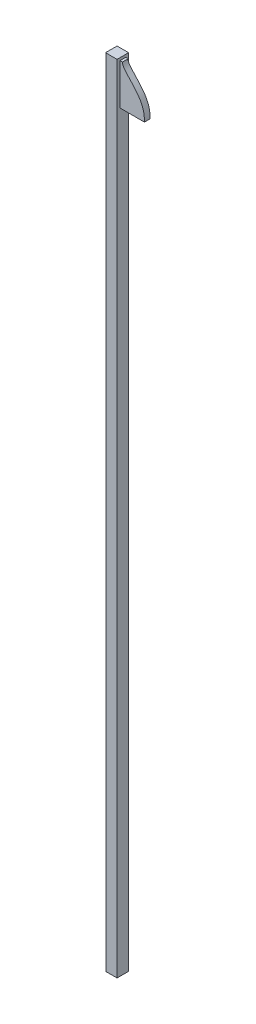
ISO-10303-21;
HEADER;
FILE_DESCRIPTION(('STEP AP214'),'2;1');
FILE_NAME('part.step','',(''),(''),'','','');
FILE_SCHEMA(('AUTOMOTIVE_DESIGN { 1 0 10303 214 1 1 1 1 }'));
ENDSEC;
DATA;
#1=APPLICATION_CONTEXT('core data for automotive mechanical design processes');
#2=APPLICATION_PROTOCOL_DEFINITION('international standard','automotive_design',2000,#1);
#3=PRODUCT_CONTEXT('',#1,'mechanical');
#4=PRODUCT('Part','Part','',(#3));
#5=PRODUCT_RELATED_PRODUCT_CATEGORY('part','',(#4));
#6=PRODUCT_DEFINITION_FORMATION('','',#4);
#7=PRODUCT_DEFINITION_CONTEXT('part definition',#1,'design');
#8=PRODUCT_DEFINITION('design','',#6,#7);
#9=PRODUCT_DEFINITION_SHAPE('','',#8);
#10=(LENGTH_UNIT() NAMED_UNIT(*) SI_UNIT(.MILLI.,.METRE.));
#11=(NAMED_UNIT(*) PLANE_ANGLE_UNIT() SI_UNIT($,.RADIAN.));
#12=(NAMED_UNIT(*) SI_UNIT($,.STERADIAN.) SOLID_ANGLE_UNIT());
#13=UNCERTAINTY_MEASURE_WITH_UNIT(LENGTH_MEASURE(1.E-05),#10,'distance_accuracy_value','');
#14=(GEOMETRIC_REPRESENTATION_CONTEXT(3) GLOBAL_UNCERTAINTY_ASSIGNED_CONTEXT((#13)) GLOBAL_UNIT_ASSIGNED_CONTEXT((#10,
#11,#12)) REPRESENTATION_CONTEXT('',''));
#15=CARTESIAN_POINT('',(0.,0.,0.));
#16=DIRECTION('',(0.,0.,1.));
#17=DIRECTION('',(1.,0.,0.));
#18=AXIS2_PLACEMENT_3D('',#15,#16,#17);
#19=CARTESIAN_POINT('',(-0.754271379437274,2.9,0.110173502610086));
#20=CARTESIAN_POINT('',(-0.756059911881393,2.89082989636708,0.110173502610086));
#21=CARTESIAN_POINT('',(-0.757688052822413,2.87160599650294,0.110173502610086));
#22=CARTESIAN_POINT('',(-0.754283259268477,2.84011903002906,0.110173502610086));
#23=CARTESIAN_POINT('',(-0.737966519602591,2.79279596856583,0.110173502610086));
#24=CARTESIAN_POINT('',(-0.697785468714333,2.7245390714351,0.110173502610086));
#25=CARTESIAN_POINT('',(-0.638294458126951,2.64698716653611,0.110173502610086));
#26=CARTESIAN_POINT('',(-0.561118331093695,2.56007299012793,0.110173502610086));
#27=CARTESIAN_POINT('',(-0.469917194208403,2.46405442724653,0.110173502610086));
#28=CARTESIAN_POINT('',(-0.370218593172325,2.35951057822847,0.110173502610086));
#29=CARTESIAN_POINT('',(-0.268406549547145,2.24717531020337,0.110173502610086));
#30=CARTESIAN_POINT('',(-0.170985439766142,2.1278493463251,0.110173502610086));
#31=CARTESIAN_POINT('',(-0.083811744606569,2.00231200075987,0.110173502610086));
#32=CARTESIAN_POINT('',(-0.0111822678173812,1.87125590361862,0.110173502610086));
#33=CARTESIAN_POINT('',(0.0446474719014038,1.7352418345057,0.110173502610086));
#34=CARTESIAN_POINT('',(0.0827004100197384,1.59469395369209,0.110173502610086));
#35=CARTESIAN_POINT('',(0.0988101809346095,1.47885746966527,0.110173502610086));
#36=CARTESIAN_POINT('',(0.102928931664183,1.39013939139415,0.110173502610086));
#37=CARTESIAN_POINT('',(0.102161316913395,1.33018182743931,0.110173502610086));
#38=CARTESIAN_POINT('',(0.100899125819202,1.3,0.110173502610086));
#39=B_SPLINE_CURVE_WITH_KNOTS('',5,(#19,#20,#21,#22,#23,#24,#25,#26,#27,#28,#29,#30,#31,#32,#33,
#34,#35,#36,#37,#38),.UNSPECIFIED.,.F.,.F.,(6,1,1,1,1,1,1,1,1,1,1,1,1,1,1,6),(0.,
0.0666666666666667,0.133333333333333,0.2,0.266666666666667,0.333333333333333,0.4,
0.466666666666667,0.533333333333333,0.6,0.666666666666667,0.733333333333333,0.8,
0.866666666666667,0.933333333333333,1.),.UNSPECIFIED.);
#40=DIRECTION('',(0.,0.,-1.));
#41=VECTOR('',#40,1.);
#42=SURFACE_OF_LINEAR_EXTRUSION('',#39,#41);
#43=CARTESIAN_POINT('',(-0.754271379437274,2.9,-0.110173502610086));
#44=CARTESIAN_POINT('',(-0.756059911881393,2.89082989636708,-0.110173502610086));
#45=CARTESIAN_POINT('',(-0.757688052822413,2.87160599650294,-0.110173502610086));
#46=CARTESIAN_POINT('',(-0.754283259268477,2.84011903002906,-0.110173502610086));
#47=CARTESIAN_POINT('',(-0.737966519602591,2.79279596856583,-0.110173502610086));
#48=CARTESIAN_POINT('',(-0.697785468714333,2.7245390714351,-0.110173502610086));
#49=CARTESIAN_POINT('',(-0.638294458126951,2.64698716653611,-0.110173502610086));
#50=CARTESIAN_POINT('',(-0.561118331093695,2.56007299012793,-0.110173502610086));
#51=CARTESIAN_POINT('',(-0.469917194208403,2.46405442724653,-0.110173502610086));
#52=CARTESIAN_POINT('',(-0.370218593172325,2.35951057822847,-0.110173502610086));
#53=CARTESIAN_POINT('',(-0.268406549547145,2.24717531020337,-0.110173502610086));
#54=CARTESIAN_POINT('',(-0.170985439766142,2.1278493463251,-0.110173502610086));
#55=CARTESIAN_POINT('',(-0.083811744606569,2.00231200075987,-0.110173502610086));
#56=CARTESIAN_POINT('',(-0.0111822678173812,1.87125590361862,-0.110173502610086));
#57=CARTESIAN_POINT('',(0.0446474719014038,1.7352418345057,-0.110173502610086));
#58=CARTESIAN_POINT('',(0.0827004100197384,1.59469395369209,-0.110173502610086));
#59=CARTESIAN_POINT('',(0.0988101809346095,1.47885746966527,-0.110173502610086));
#60=CARTESIAN_POINT('',(0.102928931664183,1.39013939139415,-0.110173502610086));
#61=CARTESIAN_POINT('',(0.102161316913395,1.33018182743931,-0.110173502610086));
#62=CARTESIAN_POINT('',(0.100899125819202,1.3,-0.110173502610086));
#63=B_SPLINE_CURVE_WITH_KNOTS('',5,(#43,#44,#45,#46,#47,#48,#49,#50,#51,#52,#53,#54,#55,#56,#57,
#58,#59,#60,#61,#62),.UNSPECIFIED.,.F.,.F.,(6,1,1,1,1,1,1,1,1,1,1,1,1,1,1,6),(0.,
0.0666666666666667,0.133333333333333,0.2,0.266666666666667,0.333333333333333,0.4,
0.466666666666667,0.533333333333333,0.6,0.666666666666667,0.733333333333333,0.8,
0.866666666666667,0.933333333333333,1.),.UNSPECIFIED.);
#64=CARTESIAN_POINT('',(-0.754271379437274,2.9,-0.110173502610086));
#65=VERTEX_POINT('',#64);
#66=CARTESIAN_POINT('',(0.100899125819202,1.3,-0.110173502610086));
#67=VERTEX_POINT('',#66);
#68=EDGE_CURVE('E141',#65,#67,#63,.T.);
#69=ORIENTED_EDGE('',*,*,#68,.F.);
#70=DIRECTION('',(0.,0.,-1.));
#71=VECTOR('',#70,1.);
#72=CARTESIAN_POINT('',(-0.754271379437274,2.9,0.110173502610086));
#73=LINE('',#72,#71);
#74=CARTESIAN_POINT('',(-0.754271379437274,2.9,0.110173502610086));
#75=VERTEX_POINT('',#74);
#76=EDGE_CURVE('E130',#75,#65,#73,.T.);
#77=ORIENTED_EDGE('',*,*,#76,.F.);
#78=CARTESIAN_POINT('',(0.100899125819202,1.3,0.110173502610086));
#79=VERTEX_POINT('',#78);
#80=EDGE_CURVE('E143',#75,#79,#39,.T.);
#81=ORIENTED_EDGE('',*,*,#80,.T.);
#82=DIRECTION('',(0.,0.,-1.));
#83=VECTOR('',#82,1.);
#84=CARTESIAN_POINT('',(0.100899125819202,1.3,0.110173502610086));
#85=LINE('',#84,#83);
#86=EDGE_CURVE('E212',#79,#67,#85,.T.);
#87=ORIENTED_EDGE('',*,*,#86,.T.);
#88=EDGE_LOOP('',(#69,#77,#81,#87));
#89=FACE_BOUND('',#88,.T.);
#90=ADVANCED_FACE('F33',(#89),#42,.T.);
#91=CARTESIAN_POINT('',(-0.85,2.9,0.110173502610086));
#92=DIRECTION('',(0.,1.,0.));
#93=DIRECTION('',(0.,0.,1.));
#94=AXIS2_PLACEMENT_3D('',#91,#92,#93);
#95=PLANE('',#94);
#96=DIRECTION('',(1.,0.,0.));
#97=VECTOR('',#96,1.);
#98=CARTESIAN_POINT('',(-0.85,2.9,-0.110173502610086));
#99=LINE('',#98,#97);
#100=CARTESIAN_POINT('',(-0.85,2.9,-0.110173502610086));
#101=VERTEX_POINT('',#100);
#102=EDGE_CURVE('E150',#101,#65,#99,.T.);
#103=ORIENTED_EDGE('',*,*,#102,.F.);
#104=DIRECTION('',(0.,0.,-1.));
#105=VECTOR('',#104,1.);
#106=CARTESIAN_POINT('',(-0.85,2.9,0.110173502610086));
#107=LINE('',#106,#105);
#108=CARTESIAN_POINT('',(-0.85,2.9,0.110173502610086));
#109=VERTEX_POINT('',#108);
#110=EDGE_CURVE('E211',#109,#101,#107,.T.);
#111=ORIENTED_EDGE('',*,*,#110,.F.);
#112=DIRECTION('',(1.,0.,0.));
#113=VECTOR('',#112,1.);
#114=CARTESIAN_POINT('',(-0.85,2.9,0.110173502610086));
#115=LINE('',#114,#113);
#116=EDGE_CURVE('E215',#109,#75,#115,.T.);
#117=ORIENTED_EDGE('',*,*,#116,.T.);
#118=ORIENTED_EDGE('',*,*,#76,.T.);
#119=EDGE_LOOP('',(#103,#111,#117,#118));
#120=FACE_BOUND('',#119,.T.);
#121=ADVANCED_FACE('F157',(#120),#95,.T.);
#122=CARTESIAN_POINT('',(0.100899125819202,1.3,0.110173502610086));
#123=DIRECTION('',(0.,-1.,0.));
#124=DIRECTION('',(0.,0.,-1.));
#125=AXIS2_PLACEMENT_3D('',#122,#123,#124);
#126=PLANE('',#125);
#127=DIRECTION('',(-1.,0.,0.));
#128=VECTOR('',#127,1.);
#129=CARTESIAN_POINT('',(0.100899125819202,1.3,-0.110173502610086));
#130=LINE('',#129,#128);
#131=CARTESIAN_POINT('',(-0.85,1.3,-0.110173502610086));
#132=VERTEX_POINT('',#131);
#133=EDGE_CURVE('E223',#67,#132,#130,.T.);
#134=ORIENTED_EDGE('',*,*,#133,.F.);
#135=ORIENTED_EDGE('',*,*,#86,.F.);
#136=DIRECTION('',(-1.,0.,0.));
#137=VECTOR('',#136,1.);
#138=CARTESIAN_POINT('',(0.100899125819202,1.3,0.110173502610086));
#139=LINE('',#138,#137);
#140=CARTESIAN_POINT('',(-0.85,1.3,0.110173502610086));
#141=VERTEX_POINT('',#140);
#142=EDGE_CURVE('E149',#79,#141,#139,.T.);
#143=ORIENTED_EDGE('',*,*,#142,.T.);
#144=DIRECTION('',(0.,0.,-1.));
#145=VECTOR('',#144,1.);
#146=CARTESIAN_POINT('',(-0.85,1.3,0.110173502610086));
#147=LINE('',#146,#145);
#148=EDGE_CURVE('E205',#141,#132,#147,.T.);
#149=ORIENTED_EDGE('',*,*,#148,.T.);
#150=EDGE_LOOP('',(#134,#135,#143,#149));
#151=FACE_BOUND('',#150,.T.);
#152=ADVANCED_FACE('F159',(#151),#126,.T.);
#153=CARTESIAN_POINT('',(-0.319454777182765,2.30241907387232,0.110173502610086));
#154=DIRECTION('',(0.,0.,-1.));
#155=DIRECTION('',(-1.,0.,0.));
#156=AXIS2_PLACEMENT_3D('',#153,#154,#155);
#157=PLANE('',#156);
#158=ORIENTED_EDGE('',*,*,#80,.F.);
#159=ORIENTED_EDGE('',*,*,#116,.F.);
#160=DIRECTION('',(0.,1.,0.));
#161=VECTOR('',#160,1.);
#162=CARTESIAN_POINT('',(-0.85,1.3,0.110173502610086));
#163=LINE('',#162,#161);
#164=EDGE_CURVE('E207',#141,#109,#163,.T.);
#165=ORIENTED_EDGE('',*,*,#164,.F.);
#166=ORIENTED_EDGE('',*,*,#142,.F.);
#167=EDGE_LOOP('',(#158,#159,#165,#166));
#168=FACE_BOUND('',#167,.T.);
#169=ADVANCED_FACE('F162',(#168),#157,.F.);
#170=CARTESIAN_POINT('',(-0.319454777182765,2.30241907387232,-0.110173502610086));
#171=DIRECTION('',(0.,0.,-1.));
#172=DIRECTION('',(-1.,0.,0.));
#173=AXIS2_PLACEMENT_3D('',#170,#171,#172);
#174=PLANE('',#173);
#175=DIRECTION('',(0.,-1.,0.));
#176=VECTOR('',#175,1.);
#177=CARTESIAN_POINT('',(-0.85,-28.,-0.110173502610086));
#178=LINE('',#177,#176);
#179=EDGE_CURVE('E128',#101,#132,#178,.T.);
#180=ORIENTED_EDGE('',*,*,#179,.F.);
#181=ORIENTED_EDGE('',*,*,#102,.T.);
#182=ORIENTED_EDGE('',*,*,#68,.T.);
#183=ORIENTED_EDGE('',*,*,#133,.T.);
#184=EDGE_LOOP('',(#180,#181,#182,#183));
#185=FACE_BOUND('',#184,.T.);
#186=ADVANCED_FACE('F167',(#185),#174,.T.);
#187=CARTESIAN_POINT('',(-0.85,0.,0.));
#188=DIRECTION('',(1.,0.,0.));
#189=DIRECTION('',(0.,0.,-1.));
#190=AXIS2_PLACEMENT_3D('',#187,#188,#189);
#191=PLANE('',#190);
#192=DIRECTION('',(0.,-1.,0.));
#193=VECTOR('',#192,1.);
#194=CARTESIAN_POINT('',(-0.85,-28.,-0.225));
#195=LINE('',#194,#193);
#196=CARTESIAN_POINT('',(-0.85,3.,-0.225));
#197=VERTEX_POINT('',#196);
#198=CARTESIAN_POINT('',(-0.85,-28.,-0.225));
#199=VERTEX_POINT('',#198);
#200=EDGE_CURVE('E118',#197,#199,#195,.T.);
#201=ORIENTED_EDGE('',*,*,#200,.F.);
#202=DIRECTION('',(0.,0.,1.));
#203=VECTOR('',#202,1.);
#204=CARTESIAN_POINT('',(-0.85,3.,-0.110173502610086));
#205=LINE('',#204,#203);
#206=CARTESIAN_POINT('',(-0.85,3.,0.225));
#207=VERTEX_POINT('',#206);
#208=EDGE_CURVE('E114',#197,#207,#205,.T.);
#209=ORIENTED_EDGE('',*,*,#208,.T.);
#210=DIRECTION('',(0.,-1.,0.));
#211=VECTOR('',#210,1.);
#212=CARTESIAN_POINT('',(-0.85,3.,0.225));
#213=LINE('',#212,#211);
#214=CARTESIAN_POINT('',(-0.85,-28.,0.225));
#215=VERTEX_POINT('',#214);
#216=EDGE_CURVE('E135',#207,#215,#213,.T.);
#217=ORIENTED_EDGE('',*,*,#216,.T.);
#218=DIRECTION('',(0.,0.,-1.));
#219=VECTOR('',#218,1.);
#220=CARTESIAN_POINT('',(-0.85,-28.,0.225));
#221=LINE('',#220,#219);
#222=EDGE_CURVE('E108',#215,#199,#221,.T.);
#223=ORIENTED_EDGE('',*,*,#222,.T.);
#224=EDGE_LOOP('',(#201,#209,#217,#223));
#225=FACE_BOUND('',#224,.T.);
#226=ORIENTED_EDGE('',*,*,#148,.F.);
#227=ORIENTED_EDGE('',*,*,#164,.T.);
#228=ORIENTED_EDGE('',*,*,#110,.T.);
#229=ORIENTED_EDGE('',*,*,#179,.T.);
#230=EDGE_LOOP('',(#226,#227,#228,#229));
#231=FACE_BOUND('',#230,.T.);
#232=ADVANCED_FACE('F170',(#225,#231),#191,.T.);
#233=CARTESIAN_POINT('',(-1.3,-28.,0.225));
#234=DIRECTION('',(0.,-1.,0.));
#235=DIRECTION('',(0.,0.,-1.));
#236=AXIS2_PLACEMENT_3D('',#233,#234,#235);
#237=PLANE('',#236);
#238=DIRECTION('',(1.,0.,0.));
#239=VECTOR('',#238,1.);
#240=CARTESIAN_POINT('',(-1.3,-28.,0.225));
#241=LINE('',#240,#239);
#242=CARTESIAN_POINT('',(-1.275,-28.,0.225));
#243=VERTEX_POINT('',#242);
#244=EDGE_CURVE('E139',#243,#215,#241,.T.);
#245=ORIENTED_EDGE('',*,*,#244,.F.);
#246=CARTESIAN_POINT('',(-1.275,-28.,0.2));
#247=DIRECTION('',(0.,-1.,0.));
#248=DIRECTION('',(0.,0.,-1.));
#249=AXIS2_PLACEMENT_3D('',#246,#247,#248);
#250=CIRCLE('',#249,0.025);
#251=CARTESIAN_POINT('',(-1.3,-28.,0.2));
#252=VERTEX_POINT('',#251);
#253=EDGE_CURVE('E55',#243,#252,#250,.T.);
#254=ORIENTED_EDGE('',*,*,#253,.T.);
#255=DIRECTION('',(0.,0.,-1.));
#256=VECTOR('',#255,1.);
#257=CARTESIAN_POINT('',(-1.3,-28.,0.225));
#258=LINE('',#257,#256);
#259=CARTESIAN_POINT('',(-1.3,-28.,-0.225));
#260=VERTEX_POINT('',#259);
#261=EDGE_CURVE('E107',#252,#260,#258,.T.);
#262=ORIENTED_EDGE('',*,*,#261,.T.);
#263=DIRECTION('',(-1.,0.,0.));
#264=VECTOR('',#263,1.);
#265=CARTESIAN_POINT('',(-1.3,-28.,-0.225));
#266=LINE('',#265,#264);
#267=EDGE_CURVE('E123',#199,#260,#266,.T.);
#268=ORIENTED_EDGE('',*,*,#267,.F.);
#269=ORIENTED_EDGE('',*,*,#222,.F.);
#270=EDGE_LOOP('',(#245,#254,#262,#268,#269));
#271=FACE_BOUND('',#270,.T.);
#272=ADVANCED_FACE('F180',(#271),#237,.T.);
#273=CARTESIAN_POINT('',(-1.3,3.,0.225));
#274=DIRECTION('',(0.,0.,1.));
#275=DIRECTION('',(1.,0.,0.));
#276=AXIS2_PLACEMENT_3D('',#273,#274,#275);
#277=PLANE('',#276);
#278=DIRECTION('',(1.,0.,0.));
#279=VECTOR('',#278,1.);
#280=CARTESIAN_POINT('',(-1.3,3.,0.225));
#281=LINE('',#280,#279);
#282=CARTESIAN_POINT('',(-1.275,3.,0.225));
#283=VERTEX_POINT('',#282);
#284=EDGE_CURVE('E133',#283,#207,#281,.T.);
#285=ORIENTED_EDGE('',*,*,#284,.F.);
#286=DIRECTION('',(0.,-1.,0.));
#287=VECTOR('',#286,1.);
#288=CARTESIAN_POINT('',(-1.275,-28.,0.225));
#289=LINE('',#288,#287);
#290=EDGE_CURVE('E129',#283,#243,#289,.T.);
#291=ORIENTED_EDGE('',*,*,#290,.T.);
#292=ORIENTED_EDGE('',*,*,#244,.T.);
#293=ORIENTED_EDGE('',*,*,#216,.F.);
#294=EDGE_LOOP('',(#285,#291,#292,#293));
#295=FACE_BOUND('',#294,.T.);
#296=ADVANCED_FACE('F177',(#295),#277,.T.);
#297=CARTESIAN_POINT('',(-1.3,3.,-0.110173502610086));
#298=DIRECTION('',(0.,1.,0.));
#299=DIRECTION('',(0.,0.,1.));
#300=AXIS2_PLACEMENT_3D('',#297,#298,#299);
#301=PLANE('',#300);
#302=DIRECTION('',(0.,0.,1.));
#303=VECTOR('',#302,1.);
#304=CARTESIAN_POINT('',(-1.3,3.,-0.110173502610086));
#305=LINE('',#304,#303);
#306=CARTESIAN_POINT('',(-1.3,3.,-0.225));
#307=VERTEX_POINT('',#306);
#308=CARTESIAN_POINT('',(-1.3,3.,0.2));
#309=VERTEX_POINT('',#308);
#310=EDGE_CURVE('E100',#307,#309,#305,.T.);
#311=ORIENTED_EDGE('',*,*,#310,.T.);
#312=CARTESIAN_POINT('',(-1.275,3.,0.2));
#313=DIRECTION('',(0.,1.,0.));
#314=DIRECTION('',(0.,0.,1.));
#315=AXIS2_PLACEMENT_3D('',#312,#313,#314);
#316=CIRCLE('',#315,0.025);
#317=EDGE_CURVE('E11',#309,#283,#316,.T.);
#318=ORIENTED_EDGE('',*,*,#317,.T.);
#319=ORIENTED_EDGE('',*,*,#284,.T.);
#320=ORIENTED_EDGE('',*,*,#208,.F.);
#321=DIRECTION('',(1.,0.,0.));
#322=VECTOR('',#321,1.);
#323=CARTESIAN_POINT('',(-0.85,3.,-0.225));
#324=LINE('',#323,#322);
#325=EDGE_CURVE('E111',#307,#197,#324,.T.);
#326=ORIENTED_EDGE('',*,*,#325,.F.);
#327=EDGE_LOOP('',(#311,#318,#319,#320,#326));
#328=FACE_BOUND('',#327,.T.);
#329=ADVANCED_FACE('F112',(#328),#301,.T.);
#330=CARTESIAN_POINT('',(-1.3,0.,0.));
#331=DIRECTION('',(1.,0.,0.));
#332=DIRECTION('',(0.,0.,-1.));
#333=AXIS2_PLACEMENT_3D('',#330,#331,#332);
#334=PLANE('',#333);
#335=ORIENTED_EDGE('',*,*,#261,.F.);
#336=DIRECTION('',(0.,-1.,0.));
#337=VECTOR('',#336,1.);
#338=CARTESIAN_POINT('',(-1.3,3.,0.2));
#339=LINE('',#338,#337);
#340=EDGE_CURVE('E41',#252,#309,#339,.F.);
#341=ORIENTED_EDGE('',*,*,#340,.T.);
#342=ORIENTED_EDGE('',*,*,#310,.F.);
#343=DIRECTION('',(0.,1.,0.));
#344=VECTOR('',#343,1.);
#345=CARTESIAN_POINT('',(-1.3,3.,-0.225));
#346=LINE('',#345,#344);
#347=EDGE_CURVE('E104',#260,#307,#346,.T.);
#348=ORIENTED_EDGE('',*,*,#347,.F.);
#349=EDGE_LOOP('',(#335,#341,#342,#348));
#350=FACE_BOUND('',#349,.T.);
#351=ADVANCED_FACE('F102',(#350),#334,.F.);
#352=CARTESIAN_POINT('',(0.,0.,-0.225));
#353=DIRECTION('',(0.,0.,1.));
#354=DIRECTION('',(1.,0.,0.));
#355=AXIS2_PLACEMENT_3D('',#352,#353,#354);
#356=PLANE('',#355);
#357=ORIENTED_EDGE('',*,*,#347,.T.);
#358=ORIENTED_EDGE('',*,*,#325,.T.);
#359=ORIENTED_EDGE('',*,*,#200,.T.);
#360=ORIENTED_EDGE('',*,*,#267,.T.);
#361=EDGE_LOOP('',(#357,#358,#359,#360));
#362=FACE_BOUND('',#361,.T.);
#363=ADVANCED_FACE('F121',(#362),#356,.F.);
#364=CARTESIAN_POINT('',(-1.275,3.,0.2));
#365=DIRECTION('',(0.,1.,0.));
#366=DIRECTION('',(0.,0.,1.));
#367=AXIS2_PLACEMENT_3D('',#364,#365,#366);
#368=CYLINDRICAL_SURFACE('',#367,0.025);
#369=ORIENTED_EDGE('',*,*,#317,.F.);
#370=ORIENTED_EDGE('',*,*,#340,.F.);
#371=ORIENTED_EDGE('',*,*,#253,.F.);
#372=ORIENTED_EDGE('',*,*,#290,.F.);
#373=EDGE_LOOP('',(#369,#370,#371,#372));
#374=FACE_BOUND('',#373,.T.);
#375=ADVANCED_FACE('F35',(#374),#368,.T.);
#376=CLOSED_SHELL('',(#90,#121,#152,#169,#186,#232,#272,#296,#329,#351,#363,#375));
#377=MANIFOLD_SOLID_BREP('B2',#376);
#378=ADVANCED_BREP_SHAPE_REPRESENTATION('',(#18,#377),#14);
#379=SHAPE_DEFINITION_REPRESENTATION(#9,#378);
ENDSEC;
END-ISO-10303-21;
